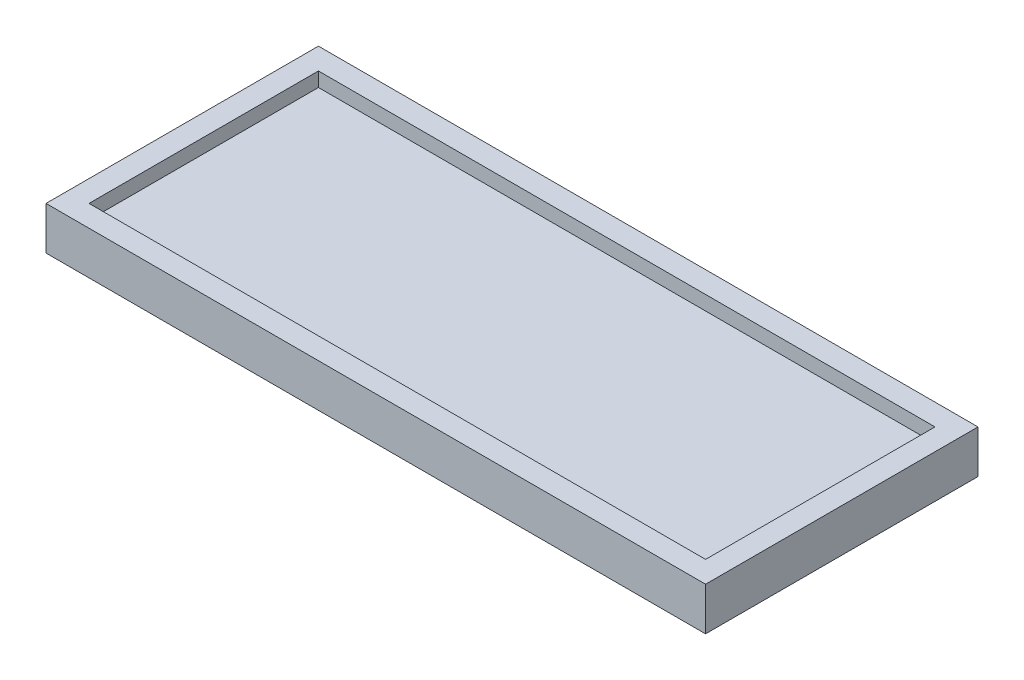
ISO-10303-21;
HEADER;
FILE_DESCRIPTION(('STEP AP214'),'2;1');
FILE_NAME('part.step','',(''),(''),'','','');
FILE_SCHEMA(('AUTOMOTIVE_DESIGN { 1 0 10303 214 1 1 1 1 }'));
ENDSEC;
DATA;
#1=APPLICATION_CONTEXT('core data for automotive mechanical design processes');
#2=APPLICATION_PROTOCOL_DEFINITION('international standard','automotive_design',2000,#1);
#3=PRODUCT_CONTEXT('',#1,'mechanical');
#4=PRODUCT('Part','Part','',(#3));
#5=PRODUCT_RELATED_PRODUCT_CATEGORY('part','',(#4));
#6=PRODUCT_DEFINITION_FORMATION('','',#4);
#7=PRODUCT_DEFINITION_CONTEXT('part definition',#1,'design');
#8=PRODUCT_DEFINITION('design','',#6,#7);
#9=PRODUCT_DEFINITION_SHAPE('','',#8);
#10=(LENGTH_UNIT() NAMED_UNIT(*) SI_UNIT(.MILLI.,.METRE.));
#11=(NAMED_UNIT(*) PLANE_ANGLE_UNIT() SI_UNIT($,.RADIAN.));
#12=(NAMED_UNIT(*) SI_UNIT($,.STERADIAN.) SOLID_ANGLE_UNIT());
#13=UNCERTAINTY_MEASURE_WITH_UNIT(LENGTH_MEASURE(1.E-05),#10,'distance_accuracy_value','');
#14=(GEOMETRIC_REPRESENTATION_CONTEXT(3) GLOBAL_UNCERTAINTY_ASSIGNED_CONTEXT((#13)) GLOBAL_UNIT_ASSIGNED_CONTEXT((#10,
#11,#12)) REPRESENTATION_CONTEXT('',''));
#15=CARTESIAN_POINT('',(0.,0.,0.));
#16=DIRECTION('',(0.,0.,1.));
#17=DIRECTION('',(1.,0.,0.));
#18=AXIS2_PLACEMENT_3D('',#15,#16,#17);
#19=CARTESIAN_POINT('',(0.,2.,0.));
#20=DIRECTION('',(0.,1.,0.));
#21=DIRECTION('',(0.,0.,1.));
#22=AXIS2_PLACEMENT_3D('',#19,#20,#21);
#23=PLANE('',#22);
#24=DIRECTION('',(0.,0.,-1.));
#25=VECTOR('',#24,1.);
#26=CARTESIAN_POINT('',(21.5,2.,-8.));
#27=LINE('',#26,#25);
#28=CARTESIAN_POINT('',(21.5,2.,8.));
#29=VERTEX_POINT('',#28);
#30=CARTESIAN_POINT('',(21.5,2.,-8.));
#31=VERTEX_POINT('',#30);
#32=EDGE_CURVE('E155',#29,#31,#27,.T.);
#33=ORIENTED_EDGE('',*,*,#32,.T.);
#34=DIRECTION('',(-1.,0.,0.));
#35=VECTOR('',#34,1.);
#36=CARTESIAN_POINT('',(-21.5,2.,-8.));
#37=LINE('',#36,#35);
#38=CARTESIAN_POINT('',(-21.5,2.,-8.));
#39=VERTEX_POINT('',#38);
#40=EDGE_CURVE('E102',#31,#39,#37,.T.);
#41=ORIENTED_EDGE('',*,*,#40,.T.);
#42=DIRECTION('',(0.,0.,1.));
#43=VECTOR('',#42,1.);
#44=CARTESIAN_POINT('',(-21.5,2.,-8.));
#45=LINE('',#44,#43);
#46=CARTESIAN_POINT('',(-21.5,2.,8.));
#47=VERTEX_POINT('',#46);
#48=EDGE_CURVE('E41',#39,#47,#45,.T.);
#49=ORIENTED_EDGE('',*,*,#48,.T.);
#50=DIRECTION('',(1.,0.,0.));
#51=VECTOR('',#50,1.);
#52=CARTESIAN_POINT('',(-21.5,2.,8.));
#53=LINE('',#52,#51);
#54=EDGE_CURVE('E11',#47,#29,#53,.T.);
#55=ORIENTED_EDGE('',*,*,#54,.T.);
#56=EDGE_LOOP('',(#33,#41,#49,#55));
#57=FACE_BOUND('',#56,.T.);
#58=ADVANCED_FACE('F33',(#57),#23,.T.);
#59=CARTESIAN_POINT('',(-23.,3.,-9.5));
#60=DIRECTION('',(0.,0.,-1.));
#61=DIRECTION('',(-1.,0.,0.));
#62=AXIS2_PLACEMENT_3D('',#59,#60,#61);
#63=PLANE('',#62);
#64=DIRECTION('',(1.,0.,0.));
#65=VECTOR('',#64,1.);
#66=CARTESIAN_POINT('',(-23.,0.,-9.5));
#67=LINE('',#66,#65);
#68=CARTESIAN_POINT('',(-23.,0.,-9.5));
#69=VERTEX_POINT('',#68);
#70=CARTESIAN_POINT('',(23.,0.,-9.5));
#71=VERTEX_POINT('',#70);
#72=EDGE_CURVE('E125',#69,#71,#67,.T.);
#73=ORIENTED_EDGE('',*,*,#72,.F.);
#74=DIRECTION('',(0.,-1.,0.));
#75=VECTOR('',#74,1.);
#76=CARTESIAN_POINT('',(-23.,3.,-9.5));
#77=LINE('',#76,#75);
#78=CARTESIAN_POINT('',(-23.,3.,-9.5));
#79=VERTEX_POINT('',#78);
#80=EDGE_CURVE('E153',#79,#69,#77,.T.);
#81=ORIENTED_EDGE('',*,*,#80,.F.);
#82=DIRECTION('',(1.,0.,0.));
#83=VECTOR('',#82,1.);
#84=CARTESIAN_POINT('',(-23.,3.,-9.5));
#85=LINE('',#84,#83);
#86=CARTESIAN_POINT('',(23.,3.,-9.5));
#87=VERTEX_POINT('',#86);
#88=EDGE_CURVE('E129',#79,#87,#85,.T.);
#89=ORIENTED_EDGE('',*,*,#88,.T.);
#90=DIRECTION('',(0.,-1.,0.));
#91=VECTOR('',#90,1.);
#92=CARTESIAN_POINT('',(23.,3.,-9.5));
#93=LINE('',#92,#91);
#94=EDGE_CURVE('E142',#87,#71,#93,.T.);
#95=ORIENTED_EDGE('',*,*,#94,.T.);
#96=EDGE_LOOP('',(#73,#81,#89,#95));
#97=FACE_BOUND('',#96,.T.);
#98=ADVANCED_FACE('F175',(#97),#63,.T.);
#99=CARTESIAN_POINT('',(-23.,3.,9.5));
#100=DIRECTION('',(-1.,0.,0.));
#101=DIRECTION('',(0.,0.,1.));
#102=AXIS2_PLACEMENT_3D('',#99,#100,#101);
#103=PLANE('',#102);
#104=DIRECTION('',(0.,0.,-1.));
#105=VECTOR('',#104,1.);
#106=CARTESIAN_POINT('',(-23.,0.,9.5));
#107=LINE('',#106,#105);
#108=CARTESIAN_POINT('',(-23.,0.,9.5));
#109=VERTEX_POINT('',#108);
#110=EDGE_CURVE('E133',#109,#69,#107,.T.);
#111=ORIENTED_EDGE('',*,*,#110,.F.);
#112=DIRECTION('',(0.,-1.,0.));
#113=VECTOR('',#112,1.);
#114=CARTESIAN_POINT('',(-23.,3.,9.5));
#115=LINE('',#114,#113);
#116=CARTESIAN_POINT('',(-23.,3.,9.5));
#117=VERTEX_POINT('',#116);
#118=EDGE_CURVE('E156',#117,#109,#115,.T.);
#119=ORIENTED_EDGE('',*,*,#118,.F.);
#120=DIRECTION('',(0.,0.,-1.));
#121=VECTOR('',#120,1.);
#122=CARTESIAN_POINT('',(-23.,3.,9.5));
#123=LINE('',#122,#121);
#124=EDGE_CURVE('E139',#117,#79,#123,.T.);
#125=ORIENTED_EDGE('',*,*,#124,.T.);
#126=ORIENTED_EDGE('',*,*,#80,.T.);
#127=EDGE_LOOP('',(#111,#119,#125,#126));
#128=FACE_BOUND('',#127,.T.);
#129=ADVANCED_FACE('F179',(#128),#103,.T.);
#130=CARTESIAN_POINT('',(23.,3.,9.5));
#131=DIRECTION('',(0.,0.,1.));
#132=DIRECTION('',(1.,0.,0.));
#133=AXIS2_PLACEMENT_3D('',#130,#131,#132);
#134=PLANE('',#133);
#135=DIRECTION('',(-1.,0.,0.));
#136=VECTOR('',#135,1.);
#137=CARTESIAN_POINT('',(23.,0.,9.5));
#138=LINE('',#137,#136);
#139=CARTESIAN_POINT('',(23.,0.,9.5));
#140=VERTEX_POINT('',#139);
#141=EDGE_CURVE('E148',#140,#109,#138,.T.);
#142=ORIENTED_EDGE('',*,*,#141,.F.);
#143=DIRECTION('',(0.,-1.,0.));
#144=VECTOR('',#143,1.);
#145=CARTESIAN_POINT('',(23.,3.,9.5));
#146=LINE('',#145,#144);
#147=CARTESIAN_POINT('',(23.,3.,9.5));
#148=VERTEX_POINT('',#147);
#149=EDGE_CURVE('E158',#148,#140,#146,.T.);
#150=ORIENTED_EDGE('',*,*,#149,.F.);
#151=DIRECTION('',(-1.,0.,0.));
#152=VECTOR('',#151,1.);
#153=CARTESIAN_POINT('',(23.,3.,9.5));
#154=LINE('',#153,#152);
#155=EDGE_CURVE('E136',#148,#117,#154,.T.);
#156=ORIENTED_EDGE('',*,*,#155,.T.);
#157=ORIENTED_EDGE('',*,*,#118,.T.);
#158=EDGE_LOOP('',(#142,#150,#156,#157));
#159=FACE_BOUND('',#158,.T.);
#160=ADVANCED_FACE('F186',(#159),#134,.T.);
#161=CARTESIAN_POINT('',(23.,3.,-9.5));
#162=DIRECTION('',(1.,0.,0.));
#163=DIRECTION('',(0.,0.,-1.));
#164=AXIS2_PLACEMENT_3D('',#161,#162,#163);
#165=PLANE('',#164);
#166=DIRECTION('',(0.,0.,1.));
#167=VECTOR('',#166,1.);
#168=CARTESIAN_POINT('',(23.,0.,-9.5));
#169=LINE('',#168,#167);
#170=EDGE_CURVE('E145',#71,#140,#169,.T.);
#171=ORIENTED_EDGE('',*,*,#170,.F.);
#172=ORIENTED_EDGE('',*,*,#94,.F.);
#173=DIRECTION('',(0.,0.,1.));
#174=VECTOR('',#173,1.);
#175=CARTESIAN_POINT('',(23.,3.,-9.5));
#176=LINE('',#175,#174);
#177=EDGE_CURVE('E132',#87,#148,#176,.T.);
#178=ORIENTED_EDGE('',*,*,#177,.T.);
#179=ORIENTED_EDGE('',*,*,#149,.T.);
#180=EDGE_LOOP('',(#171,#172,#178,#179));
#181=FACE_BOUND('',#180,.T.);
#182=ADVANCED_FACE('F183',(#181),#165,.T.);
#183=CARTESIAN_POINT('',(0.,3.,0.));
#184=DIRECTION('',(0.,-1.,0.));
#185=DIRECTION('',(0.,0.,-1.));
#186=AXIS2_PLACEMENT_3D('',#183,#184,#185);
#187=PLANE('',#186);
#188=DIRECTION('',(0.,0.,-1.));
#189=VECTOR('',#188,1.);
#190=CARTESIAN_POINT('',(-21.5,3.,8.));
#191=LINE('',#190,#189);
#192=CARTESIAN_POINT('',(-21.5,3.,8.));
#193=VERTEX_POINT('',#192);
#194=CARTESIAN_POINT('',(-21.5,3.,-8.));
#195=VERTEX_POINT('',#194);
#196=EDGE_CURVE('E105',#193,#195,#191,.T.);
#197=ORIENTED_EDGE('',*,*,#196,.T.);
#198=DIRECTION('',(1.,0.,0.));
#199=VECTOR('',#198,1.);
#200=CARTESIAN_POINT('',(-21.5,3.,-8.));
#201=LINE('',#200,#199);
#202=CARTESIAN_POINT('',(21.5,3.,-8.));
#203=VERTEX_POINT('',#202);
#204=EDGE_CURVE('E99',#195,#203,#201,.T.);
#205=ORIENTED_EDGE('',*,*,#204,.T.);
#206=DIRECTION('',(0.,0.,1.));
#207=VECTOR('',#206,1.);
#208=CARTESIAN_POINT('',(21.5,3.,-8.));
#209=LINE('',#208,#207);
#210=CARTESIAN_POINT('',(21.5,3.,8.));
#211=VERTEX_POINT('',#210);
#212=EDGE_CURVE('E109',#203,#211,#209,.T.);
#213=ORIENTED_EDGE('',*,*,#212,.T.);
#214=DIRECTION('',(-1.,0.,0.));
#215=VECTOR('',#214,1.);
#216=CARTESIAN_POINT('',(21.5,3.,8.));
#217=LINE('',#216,#215);
#218=EDGE_CURVE('E114',#211,#193,#217,.T.);
#219=ORIENTED_EDGE('',*,*,#218,.T.);
#220=EDGE_LOOP('',(#197,#205,#213,#219));
#221=FACE_BOUND('',#220,.T.);
#222=ORIENTED_EDGE('',*,*,#88,.F.);
#223=ORIENTED_EDGE('',*,*,#124,.F.);
#224=ORIENTED_EDGE('',*,*,#155,.F.);
#225=ORIENTED_EDGE('',*,*,#177,.F.);
#226=EDGE_LOOP('',(#222,#223,#224,#225));
#227=FACE_BOUND('',#226,.T.);
#228=ADVANCED_FACE('F116',(#221,#227),#187,.F.);
#229=CARTESIAN_POINT('',(-21.5,3.,-8.));
#230=DIRECTION('',(0.,0.,-1.));
#231=DIRECTION('',(-1.,0.,0.));
#232=AXIS2_PLACEMENT_3D('',#229,#230,#231);
#233=PLANE('',#232);
#234=ORIENTED_EDGE('',*,*,#40,.F.);
#235=DIRECTION('',(0.,-1.,0.));
#236=VECTOR('',#235,1.);
#237=CARTESIAN_POINT('',(21.5,3.,-8.));
#238=LINE('',#237,#236);
#239=EDGE_CURVE('E48',#203,#31,#238,.T.);
#240=ORIENTED_EDGE('',*,*,#239,.F.);
#241=ORIENTED_EDGE('',*,*,#204,.F.);
#242=DIRECTION('',(0.,-1.,0.));
#243=VECTOR('',#242,1.);
#244=CARTESIAN_POINT('',(-21.5,3.,-8.));
#245=LINE('',#244,#243);
#246=EDGE_CURVE('E123',#195,#39,#245,.T.);
#247=ORIENTED_EDGE('',*,*,#246,.T.);
#248=EDGE_LOOP('',(#234,#240,#241,#247));
#249=FACE_BOUND('',#248,.T.);
#250=ADVANCED_FACE('F97',(#249),#233,.F.);
#251=CARTESIAN_POINT('',(-21.5,3.,8.));
#252=DIRECTION('',(-1.,0.,0.));
#253=DIRECTION('',(0.,0.,1.));
#254=AXIS2_PLACEMENT_3D('',#251,#252,#253);
#255=PLANE('',#254);
#256=ORIENTED_EDGE('',*,*,#48,.F.);
#257=ORIENTED_EDGE('',*,*,#246,.F.);
#258=ORIENTED_EDGE('',*,*,#196,.F.);
#259=DIRECTION('',(0.,-1.,0.));
#260=VECTOR('',#259,1.);
#261=CARTESIAN_POINT('',(-21.5,3.,8.));
#262=LINE('',#261,#260);
#263=EDGE_CURVE('E126',#193,#47,#262,.T.);
#264=ORIENTED_EDGE('',*,*,#263,.T.);
#265=EDGE_LOOP('',(#256,#257,#258,#264));
#266=FACE_BOUND('',#265,.T.);
#267=ADVANCED_FACE('F165',(#266),#255,.F.);
#268=CARTESIAN_POINT('',(21.5,3.,8.));
#269=DIRECTION('',(0.,0.,1.));
#270=DIRECTION('',(1.,0.,0.));
#271=AXIS2_PLACEMENT_3D('',#268,#269,#270);
#272=PLANE('',#271);
#273=ORIENTED_EDGE('',*,*,#54,.F.);
#274=ORIENTED_EDGE('',*,*,#263,.F.);
#275=ORIENTED_EDGE('',*,*,#218,.F.);
#276=DIRECTION('',(0.,-1.,0.));
#277=VECTOR('',#276,1.);
#278=CARTESIAN_POINT('',(21.5,3.,8.));
#279=LINE('',#278,#277);
#280=EDGE_CURVE('E104',#211,#29,#279,.T.);
#281=ORIENTED_EDGE('',*,*,#280,.T.);
#282=EDGE_LOOP('',(#273,#274,#275,#281));
#283=FACE_BOUND('',#282,.T.);
#284=ADVANCED_FACE('F164',(#283),#272,.F.);
#285=CARTESIAN_POINT('',(21.5,3.,-8.));
#286=DIRECTION('',(1.,0.,0.));
#287=DIRECTION('',(0.,0.,-1.));
#288=AXIS2_PLACEMENT_3D('',#285,#286,#287);
#289=PLANE('',#288);
#290=ORIENTED_EDGE('',*,*,#32,.F.);
#291=ORIENTED_EDGE('',*,*,#280,.F.);
#292=ORIENTED_EDGE('',*,*,#212,.F.);
#293=ORIENTED_EDGE('',*,*,#239,.T.);
#294=EDGE_LOOP('',(#290,#291,#292,#293));
#295=FACE_BOUND('',#294,.T.);
#296=ADVANCED_FACE('F110',(#295),#289,.F.);
#297=CARTESIAN_POINT('',(0.,0.,0.));
#298=DIRECTION('',(0.,1.,0.));
#299=DIRECTION('',(0.,0.,1.));
#300=AXIS2_PLACEMENT_3D('',#297,#298,#299);
#301=PLANE('',#300);
#302=ORIENTED_EDGE('',*,*,#72,.T.);
#303=ORIENTED_EDGE('',*,*,#170,.T.);
#304=ORIENTED_EDGE('',*,*,#141,.T.);
#305=ORIENTED_EDGE('',*,*,#110,.T.);
#306=EDGE_LOOP('',(#302,#303,#304,#305));
#307=FACE_BOUND('',#306,.T.);
#308=ADVANCED_FACE('F35',(#307),#301,.F.);
#309=CLOSED_SHELL('',(#58,#98,#129,#160,#182,#228,#250,#267,#284,#296,#308));
#310=MANIFOLD_SOLID_BREP('B2',#309);
#311=ADVANCED_BREP_SHAPE_REPRESENTATION('',(#18,#310),#14);
#312=SHAPE_DEFINITION_REPRESENTATION(#9,#311);
ENDSEC;
END-ISO-10303-21;
